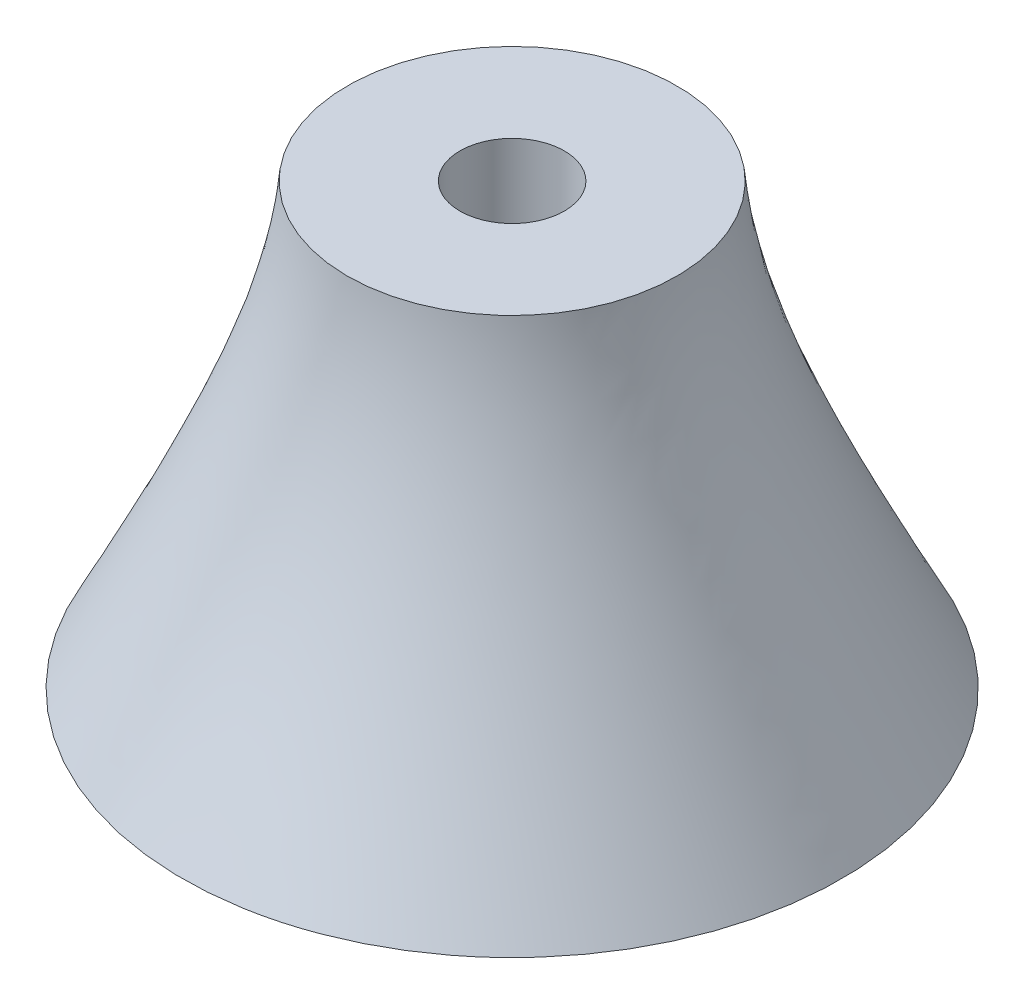
ISO-10303-21;
HEADER;
FILE_DESCRIPTION(('STEP AP214'),'2;1');
FILE_NAME('part.step','',(''),(''),'','','');
FILE_SCHEMA(('AUTOMOTIVE_DESIGN { 1 0 10303 214 1 1 1 1 }'));
ENDSEC;
DATA;
#1=APPLICATION_CONTEXT('core data for automotive mechanical design processes');
#2=APPLICATION_PROTOCOL_DEFINITION('international standard','automotive_design',2000,#1);
#3=PRODUCT_CONTEXT('',#1,'mechanical');
#4=PRODUCT('Part','Part','',(#3));
#5=PRODUCT_RELATED_PRODUCT_CATEGORY('part','',(#4));
#6=PRODUCT_DEFINITION_FORMATION('','',#4);
#7=PRODUCT_DEFINITION_CONTEXT('part definition',#1,'design');
#8=PRODUCT_DEFINITION('design','',#6,#7);
#9=PRODUCT_DEFINITION_SHAPE('','',#8);
#10=(LENGTH_UNIT() NAMED_UNIT(*) SI_UNIT(.MILLI.,.METRE.));
#11=(NAMED_UNIT(*) PLANE_ANGLE_UNIT() SI_UNIT($,.RADIAN.));
#12=(NAMED_UNIT(*) SI_UNIT($,.STERADIAN.) SOLID_ANGLE_UNIT());
#13=UNCERTAINTY_MEASURE_WITH_UNIT(LENGTH_MEASURE(1.E-05),#10,'distance_accuracy_value','');
#14=(GEOMETRIC_REPRESENTATION_CONTEXT(3) GLOBAL_UNCERTAINTY_ASSIGNED_CONTEXT((#13)) GLOBAL_UNIT_ASSIGNED_CONTEXT((#10,
#11,#12)) REPRESENTATION_CONTEXT('',''));
#15=CARTESIAN_POINT('',(0.,0.,0.));
#16=DIRECTION('',(0.,0.,1.));
#17=DIRECTION('',(1.,0.,0.));
#18=AXIS2_PLACEMENT_3D('',#15,#16,#17);
#19=CARTESIAN_POINT('',(0.,0.,0.));
#20=DIRECTION('',(0.,1.,0.));
#21=DIRECTION('',(0.,0.,1.));
#22=AXIS2_PLACEMENT_3D('',#19,#20,#21);
#23=PLANE('',#22);
#24=CARTESIAN_POINT('',(0.,0.,0.));
#25=DIRECTION('',(0.,1.,0.));
#26=DIRECTION('',(0.,0.,1.));
#27=AXIS2_PLACEMENT_3D('',#24,#25,#26);
#28=CIRCLE('',#27,4.75);
#29=CARTESIAN_POINT('',(0.,0.,4.75));
#30=VERTEX_POINT('',#29);
#31=EDGE_CURVE('E48',#30,#30,#28,.T.);
#32=ORIENTED_EDGE('',*,*,#31,.T.);
#33=EDGE_LOOP('',(#32));
#34=FACE_BOUND('',#33,.T.);
#35=CARTESIAN_POINT('',(0.,0.,0.));
#36=DIRECTION('',(0.,1.,0.));
#37=DIRECTION('',(0.,0.,1.));
#38=AXIS2_PLACEMENT_3D('',#35,#36,#37);
#39=CIRCLE('',#38,30.);
#40=CARTESIAN_POINT('',(-14.6010402779874,0.,-26.2070529209331));
#41=VERTEX_POINT('',#40);
#42=EDGE_CURVE('E11',#41,#41,#39,.T.);
#43=ORIENTED_EDGE('',*,*,#42,.F.);
#44=EDGE_LOOP('',(#43));
#45=FACE_BOUND('',#44,.T.);
#46=ADVANCED_FACE('F35',(#34,#45),#23,.F.);
#47=CARTESIAN_POINT('',(0.,40.,0.));
#48=DIRECTION('',(0.,1.,0.));
#49=DIRECTION('',(0.,0.,1.));
#50=AXIS2_PLACEMENT_3D('',#47,#48,#49);
#51=PLANE('',#50);
#52=CARTESIAN_POINT('',(0.,40.,0.));
#53=DIRECTION('',(0.,1.,0.));
#54=DIRECTION('',(0.,0.,1.));
#55=AXIS2_PLACEMENT_3D('',#52,#53,#54);
#56=CIRCLE('',#55,4.75);
#57=CARTESIAN_POINT('',(0.,40.,4.75));
#58=VERTEX_POINT('',#57);
#59=EDGE_CURVE('E111',#58,#58,#56,.T.);
#60=ORIENTED_EDGE('',*,*,#59,.F.);
#61=EDGE_LOOP('',(#60));
#62=FACE_BOUND('',#61,.T.);
#63=CARTESIAN_POINT('',(0.,40.,0.));
#64=DIRECTION('',(0.,1.,0.));
#65=DIRECTION('',(0.,0.,1.));
#66=AXIS2_PLACEMENT_3D('',#63,#64,#65);
#67=CIRCLE('',#66,15.);
#68=CARTESIAN_POINT('',(-14.8063736900087,40.,-2.40235262853273));
#69=VERTEX_POINT('',#68);
#70=EDGE_CURVE('E43',#69,#69,#67,.T.);
#71=ORIENTED_EDGE('',*,*,#70,.T.);
#72=EDGE_LOOP('',(#71));
#73=FACE_BOUND('',#72,.T.);
#74=ADVANCED_FACE('F68',(#62,#73),#51,.T.);
#75=CARTESIAN_POINT('',(-14.8063736900087,40.,-2.40235262853273));
#76=CARTESIAN_POINT('',(-14.6010402779874,0.,-26.2070529209331));
#77=CARTESIAN_POINT('',(-10.0016684329432,40.,-32.0151000085501));
#78=CARTESIAN_POINT('',(37.8130655638788,0.,-55.409133476908));
#79=CARTESIAN_POINT('',(19.6110789470742,40.,-27.2103947514847));
#80=CARTESIAN_POINT('',(67.0151461198536,0.,-2.99502763504178));
#81=CARTESIAN_POINT('',(14.8063736900087,40.,2.40235262853273));
#82=CARTESIAN_POINT('',(14.6010402779874,0.,26.2070529209331));
#83=CARTESIAN_POINT('',(10.0016684329432,40.,32.0151000085501));
#84=CARTESIAN_POINT('',(-37.8130655638788,0.,55.409133476908));
#85=CARTESIAN_POINT('',(-19.6110789470742,40.,27.2103947514847));
#86=CARTESIAN_POINT('',(-67.0151461198537,0.,2.99502763504177));
#87=CARTESIAN_POINT('',(-14.8063736900087,40.,-2.40235262853273));
#88=CARTESIAN_POINT('',(-14.6010402779874,0.,-26.2070529209331));
#89=(BOUNDED_SURFACE() B_SPLINE_SURFACE(3,1,((#75,#76),(#77,#78),(#79,#80),(#81,#82),(#83,#84),
(#85,#86),(#87,#88)),.UNSPECIFIED.,.T.,.F.,.F.) B_SPLINE_SURFACE_WITH_KNOTS((4,3,4),(2,2),(0.,
0.5,1.),(0.,1.),.UNSPECIFIED.) GEOMETRIC_REPRESENTATION_ITEM() RATIONAL_B_SPLINE_SURFACE(((1.,
1.),(0.333333333333333,0.333333333333333),(0.333333333333333,0.333333333333333),(1.,1.),
(0.333333333333333,0.333333333333333),(0.333333333333333,0.333333333333333),(1.,1.))) REPRESENTATION_ITEM('') SURFACE());
#90=CARTESIAN_POINT('',(-14.8063736900087,40.,-2.40235262853273));
#91=CARTESIAN_POINT('',(-14.8042348003001,39.5833333333333,-2.65031825657857));
#92=CARTESIAN_POINT('',(-14.8020959105916,39.1666666666667,-2.8982838846244));
#93=CARTESIAN_POINT('',(-14.7978181311745,38.3333333333333,-3.39421514071608));
#94=CARTESIAN_POINT('',(-14.7956792414659,37.9166666666667,-3.64218076876191));
#95=CARTESIAN_POINT('',(-14.7914014620488,37.0833333333333,-4.13811202485359));
#96=CARTESIAN_POINT('',(-14.7892625723403,36.6666666666667,-4.38607765289943));
#97=CARTESIAN_POINT('',(-14.7849847929232,35.8333333333333,-4.8820089089911));
#98=CARTESIAN_POINT('',(-14.7828459032146,35.4166666666667,-5.12997453703694));
#99=CARTESIAN_POINT('',(-14.7785681237975,34.5833333333333,-5.62590579312861));
#100=CARTESIAN_POINT('',(-14.7764292340889,34.1666666666667,-5.87387142117445));
#101=CARTESIAN_POINT('',(-14.7721514546718,33.3333333333333,-6.36980267726612));
#102=CARTESIAN_POINT('',(-14.7700125649633,32.9166666666667,-6.61776830531196));
#103=CARTESIAN_POINT('',(-14.7657347855462,32.0833333333333,-7.11369956140364));
#104=CARTESIAN_POINT('',(-14.7635958958376,31.6666666666667,-7.36166518944947));
#105=CARTESIAN_POINT('',(-14.7593181164205,30.8333333333333,-7.85759644554115));
#106=CARTESIAN_POINT('',(-14.7571792267119,30.4166666666667,-8.10556207358698));
#107=CARTESIAN_POINT('',(-14.7529014472948,29.5833333333333,-8.60149332967866));
#108=CARTESIAN_POINT('',(-14.7507625575863,29.1666666666667,-8.8494589577245));
#109=CARTESIAN_POINT('',(-14.7464847781692,28.3333333333333,-9.34539021381617));
#110=CARTESIAN_POINT('',(-14.7443458884606,27.9166666666667,-9.59335584186201));
#111=CARTESIAN_POINT('',(-14.7400681090435,27.0833333333333,-10.0892870979537));
#112=CARTESIAN_POINT('',(-14.7379292193349,26.6666666666667,-10.3372527259995));
#113=CARTESIAN_POINT('',(-14.7336514399178,25.8333333333333,-10.8331839820912));
#114=CARTESIAN_POINT('',(-14.7315125502093,25.4166666666667,-11.081149610137));
#115=CARTESIAN_POINT('',(-14.7272347707922,24.5833333333333,-11.5770808662287));
#116=CARTESIAN_POINT('',(-14.7250958810836,24.1666666666667,-11.8250464942745));
#117=CARTESIAN_POINT('',(-14.7208181016665,23.3333333333333,-12.3209777503662));
#118=CARTESIAN_POINT('',(-14.718679211958,22.9166666666667,-12.5689433784121));
#119=CARTESIAN_POINT('',(-14.7144014325408,22.0833333333333,-13.0648746345037));
#120=CARTESIAN_POINT('',(-14.7122625428323,21.6666666666667,-13.3128402625496));
#121=CARTESIAN_POINT('',(-14.7079847634152,20.8333333333333,-13.8087715186412));
#122=CARTESIAN_POINT('',(-14.7058458737066,20.4166666666667,-14.0567371466871));
#123=CARTESIAN_POINT('',(-14.7015680942895,19.5833333333333,-14.5526684027788));
#124=CARTESIAN_POINT('',(-14.699429204581,19.1666666666667,-14.8006340308246));
#125=CARTESIAN_POINT('',(-14.6951514251639,18.3333333333333,-15.2965652869163));
#126=CARTESIAN_POINT('',(-14.6930125354553,17.9166666666667,-15.5445309149621));
#127=CARTESIAN_POINT('',(-14.6887347560382,17.0833333333333,-16.0404621710538));
#128=CARTESIAN_POINT('',(-14.6865958663296,16.6666666666667,-16.2884277990996));
#129=CARTESIAN_POINT('',(-14.6823180869125,15.8333333333333,-16.7843590551913));
#130=CARTESIAN_POINT('',(-14.680179197204,15.4166666666667,-17.0323246832371));
#131=CARTESIAN_POINT('',(-14.6759014177869,14.5833333333333,-17.5282559393288));
#132=CARTESIAN_POINT('',(-14.6737625280783,14.1666666666667,-17.7762215673746));
#133=CARTESIAN_POINT('',(-14.6694847486612,13.3333333333333,-18.2721528234663));
#134=CARTESIAN_POINT('',(-14.6673458589526,12.9166666666667,-18.5201184515122));
#135=CARTESIAN_POINT('',(-14.6630680795355,12.0833333333333,-19.0160497076038));
#136=CARTESIAN_POINT('',(-14.660929189827,11.6666666666667,-19.2640153356497));
#137=CARTESIAN_POINT('',(-14.6566514104099,10.8333333333333,-19.7599465917413));
#138=CARTESIAN_POINT('',(-14.6545125207013,10.4166666666667,-20.0079122197872));
#139=CARTESIAN_POINT('',(-14.6502347412842,9.58333333333333,-20.5038434758788));
#140=CARTESIAN_POINT('',(-14.6480958515756,9.16666666666667,-20.7518091039247));
#141=CARTESIAN_POINT('',(-14.6438180721585,8.33333333333333,-21.2477403600164));
#142=CARTESIAN_POINT('',(-14.64167918245,7.91666666666667,-21.4957059880622));
#143=CARTESIAN_POINT('',(-14.6374014030329,7.08333333333333,-21.9916372441539));
#144=CARTESIAN_POINT('',(-14.6352625133243,6.66666666666667,-22.2396028721997));
#145=CARTESIAN_POINT('',(-14.6309847339072,5.83333333333333,-22.7355341282914));
#146=CARTESIAN_POINT('',(-14.6288458441987,5.41666666666667,-22.9834997563372));
#147=CARTESIAN_POINT('',(-14.6245680647815,4.58333333333333,-23.4794310124289));
#148=CARTESIAN_POINT('',(-14.622429175073,4.16666666666667,-23.7273966404747));
#149=CARTESIAN_POINT('',(-14.6181513956559,3.33333333333333,-24.2233278965664));
#150=CARTESIAN_POINT('',(-14.6160125059473,2.91666666666667,-24.4712935246122));
#151=CARTESIAN_POINT('',(-14.6117347265302,2.08333333333333,-24.9672247807039));
#152=CARTESIAN_POINT('',(-14.6095958368217,1.66666666666667,-25.2151904087498));
#153=CARTESIAN_POINT('',(-14.6053180574046,0.833333333333334,-25.7111216648414));
#154=CARTESIAN_POINT('',(-14.603179167696,0.416666666666668,-25.9590872928873));
#155=CARTESIAN_POINT('',(-14.6010402779874,0.,-26.2070529209331));
#156=B_SPLINE_CURVE_WITH_KNOTS('',3,(#90,#91,#92,#93,#94,#95,#96,#97,#98,#99,#100,#101,#102,
#103,#104,#105,#106,#107,#108,#109,#110,#111,#112,#113,#114,#115,#116,#117,#118,#119,#120,#121,
#122,#123,#124,#125,#126,#127,#128,#129,#130,#131,#132,#133,#134,#135,#136,#137,#138,#139,#140,
#141,#142,#143,#144,#145,#146,#147,#148,#149,#150,#151,#152,#153,#154,#155),.UNSPECIFIED.,.F.,
.F.,(4,2,2,2,2,2,2,2,2,2,2,2,2,2,2,2,2,2,2,2,2,2,2,2,2,2,2,2,2,2,2,2,4),(0.,1.4546215136152,
2.9092430272304,4.36386454084559,5.81848605446079,7.27310756807598,8.72772908169118,
10.1823505953064,11.6369721089216,13.0915936225368,14.546215136152,16.0008366497672,
17.4554581633824,18.9100796769976,20.3647011906128,21.819322704228,23.2739442178432,
24.7285657314584,26.1831872450735,27.6378087586887,29.0924302723039,30.5470517859191,
32.0016732995343,33.4562948131495,34.9109163267647,36.3655378403799,37.8201593539951,
39.2747808676103,40.7294023812255,42.1840238948407,43.6386454084559,45.0932669220711,
46.5478884356863),.UNSPECIFIED.);
#157=EDGE_CURVE('BSEAM77',#69,#41,#156,.T.);
#158=ORIENTED_EDGE('',*,*,#70,.F.);
#159=ORIENTED_EDGE('',*,*,#42,.T.);
#160=ORIENTED_EDGE('',*,*,#157,.T.);
#161=ORIENTED_EDGE('',*,*,#157,.F.);
#162=EDGE_LOOP('',(#158,#160,#159,#161));
#163=FACE_BOUND('',#162,.T.);
#164=ADVANCED_FACE('F77',(#163),#89,.T.);
#165=CARTESIAN_POINT('',(0.,-20.,0.));
#166=DIRECTION('',(0.,1.,0.));
#167=DIRECTION('',(0.,0.,1.));
#168=AXIS2_PLACEMENT_3D('',#165,#166,#167);
#169=CYLINDRICAL_SURFACE('',#168,4.75);
#170=CARTESIAN_POINT('',(0.,40.,4.75));
#171=CARTESIAN_POINT('',(0.,39.5833333333333,4.75));
#172=CARTESIAN_POINT('',(0.,39.1666666666667,4.75));
#173=CARTESIAN_POINT('',(0.,38.3333333333333,4.75));
#174=CARTESIAN_POINT('',(0.,37.9166666666667,4.75));
#175=CARTESIAN_POINT('',(0.,37.0833333333333,4.75));
#176=CARTESIAN_POINT('',(0.,36.6666666666667,4.75));
#177=CARTESIAN_POINT('',(0.,35.8333333333333,4.75));
#178=CARTESIAN_POINT('',(0.,35.4166666666667,4.75));
#179=CARTESIAN_POINT('',(0.,34.5833333333333,4.75));
#180=CARTESIAN_POINT('',(0.,34.1666666666667,4.75));
#181=CARTESIAN_POINT('',(0.,33.3333333333333,4.75));
#182=CARTESIAN_POINT('',(0.,32.9166666666667,4.75));
#183=CARTESIAN_POINT('',(0.,32.0833333333333,4.75));
#184=CARTESIAN_POINT('',(0.,31.6666666666667,4.75));
#185=CARTESIAN_POINT('',(0.,30.8333333333333,4.75));
#186=CARTESIAN_POINT('',(0.,30.4166666666667,4.75));
#187=CARTESIAN_POINT('',(0.,29.5833333333333,4.75));
#188=CARTESIAN_POINT('',(0.,29.1666666666667,4.75));
#189=CARTESIAN_POINT('',(0.,28.3333333333333,4.75));
#190=CARTESIAN_POINT('',(0.,27.9166666666667,4.75));
#191=CARTESIAN_POINT('',(0.,27.0833333333333,4.75));
#192=CARTESIAN_POINT('',(0.,26.6666666666667,4.75));
#193=CARTESIAN_POINT('',(0.,25.8333333333333,4.75));
#194=CARTESIAN_POINT('',(0.,25.4166666666667,4.75));
#195=CARTESIAN_POINT('',(0.,24.5833333333333,4.75));
#196=CARTESIAN_POINT('',(0.,24.1666666666667,4.75));
#197=CARTESIAN_POINT('',(0.,23.3333333333333,4.75));
#198=CARTESIAN_POINT('',(0.,22.9166666666667,4.75));
#199=CARTESIAN_POINT('',(0.,22.0833333333333,4.75));
#200=CARTESIAN_POINT('',(0.,21.6666666666667,4.75));
#201=CARTESIAN_POINT('',(0.,20.8333333333333,4.75));
#202=CARTESIAN_POINT('',(0.,20.4166666666667,4.75));
#203=CARTESIAN_POINT('',(0.,19.5833333333333,4.75));
#204=CARTESIAN_POINT('',(0.,19.1666666666667,4.75));
#205=CARTESIAN_POINT('',(0.,18.3333333333333,4.75));
#206=CARTESIAN_POINT('',(0.,17.9166666666667,4.75));
#207=CARTESIAN_POINT('',(0.,17.0833333333333,4.75));
#208=CARTESIAN_POINT('',(0.,16.6666666666667,4.75));
#209=CARTESIAN_POINT('',(0.,15.8333333333333,4.75));
#210=CARTESIAN_POINT('',(0.,15.4166666666667,4.75));
#211=CARTESIAN_POINT('',(0.,14.5833333333333,4.75));
#212=CARTESIAN_POINT('',(0.,14.1666666666667,4.75));
#213=CARTESIAN_POINT('',(0.,13.3333333333333,4.75));
#214=CARTESIAN_POINT('',(0.,12.9166666666667,4.75));
#215=CARTESIAN_POINT('',(0.,12.0833333333333,4.75));
#216=CARTESIAN_POINT('',(0.,11.6666666666667,4.75));
#217=CARTESIAN_POINT('',(0.,10.8333333333333,4.75));
#218=CARTESIAN_POINT('',(0.,10.4166666666667,4.75));
#219=CARTESIAN_POINT('',(0.,9.58333333333333,4.75));
#220=CARTESIAN_POINT('',(0.,9.16666666666666,4.75));
#221=CARTESIAN_POINT('',(0.,8.33333333333333,4.75));
#222=CARTESIAN_POINT('',(0.,7.91666666666666,4.75));
#223=CARTESIAN_POINT('',(0.,7.08333333333333,4.75));
#224=CARTESIAN_POINT('',(0.,6.66666666666666,4.75));
#225=CARTESIAN_POINT('',(0.,5.83333333333333,4.75));
#226=CARTESIAN_POINT('',(0.,5.41666666666667,4.75));
#227=CARTESIAN_POINT('',(0.,4.58333333333333,4.75));
#228=CARTESIAN_POINT('',(0.,4.16666666666667,4.75));
#229=CARTESIAN_POINT('',(0.,3.33333333333333,4.75));
#230=CARTESIAN_POINT('',(0.,2.91666666666667,4.75));
#231=CARTESIAN_POINT('',(0.,2.08333333333333,4.75));
#232=CARTESIAN_POINT('',(0.,1.66666666666666,4.75));
#233=CARTESIAN_POINT('',(0.,0.833333333333331,4.75));
#234=CARTESIAN_POINT('',(0.,0.416666666666664,4.75));
#235=CARTESIAN_POINT('',(0.,0.,4.75));
#236=B_SPLINE_CURVE_WITH_KNOTS('',3,(#170,#171,#172,#173,#174,#175,#176,#177,#178,#179,#180,
#181,#182,#183,#184,#185,#186,#187,#188,#189,#190,#191,#192,#193,#194,#195,#196,#197,#198,#199,
#200,#201,#202,#203,#204,#205,#206,#207,#208,#209,#210,#211,#212,#213,#214,#215,#216,#217,#218,
#219,#220,#221,#222,#223,#224,#225,#226,#227,#228,#229,#230,#231,#232,#233,#234,#235),
.UNSPECIFIED.,.F.,.F.,(4,2,2,2,2,2,2,2,2,2,2,2,2,2,2,2,2,2,2,2,2,2,2,2,2,2,2,2,2,2,2,2,4),(0.,
1.25,2.5,3.75,5.,6.25,7.5,8.75,10.,11.25,12.5,13.75,15.,16.25,17.5,18.75,20.,21.25,22.5,23.75,
25.,26.25,27.5,28.75,30.,31.25,32.5,33.75,35.,36.25,37.5,38.75,40.),.UNSPECIFIED.);
#237=EDGE_CURVE('BSEAM79',#58,#30,#236,.T.);
#238=ORIENTED_EDGE('',*,*,#59,.T.);
#239=ORIENTED_EDGE('',*,*,#31,.F.);
#240=ORIENTED_EDGE('',*,*,#237,.T.);
#241=ORIENTED_EDGE('',*,*,#237,.F.);
#242=EDGE_LOOP('',(#238,#240,#239,#241));
#243=FACE_BOUND('',#242,.T.);
#244=ADVANCED_FACE('F79',(#243),#169,.F.);
#245=CLOSED_SHELL('',(#46,#74,#164,#244));
#246=MANIFOLD_SOLID_BREP('B2',#245);
#247=ADVANCED_BREP_SHAPE_REPRESENTATION('',(#18,#246),#14);
#248=SHAPE_DEFINITION_REPRESENTATION(#9,#247);
ENDSEC;
END-ISO-10303-21;
